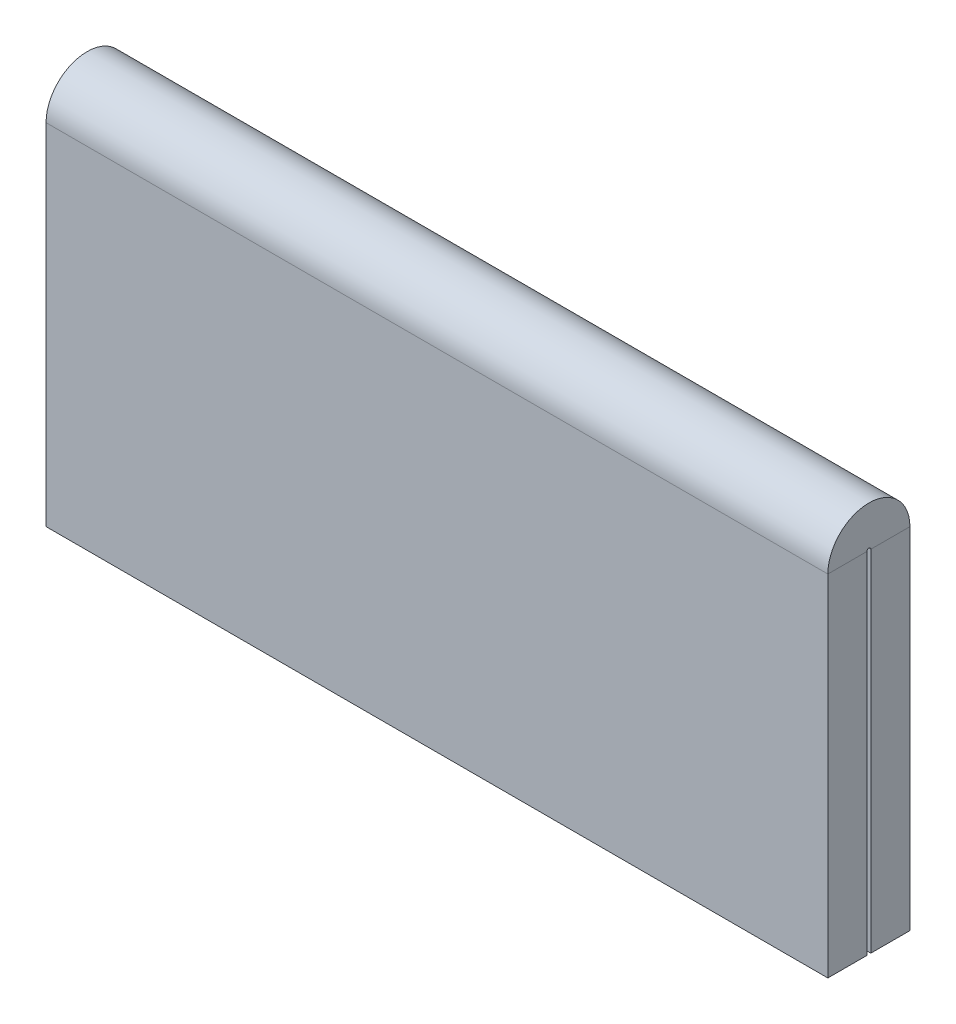
ISO-10303-21;
HEADER;
FILE_DESCRIPTION(('STEP AP214'),'2;1');
FILE_NAME('part.step','',(''),(''),'','','');
FILE_SCHEMA(('AUTOMOTIVE_DESIGN { 1 0 10303 214 1 1 1 1 }'));
ENDSEC;
DATA;
#1=APPLICATION_CONTEXT('core data for automotive mechanical design processes');
#2=APPLICATION_PROTOCOL_DEFINITION('international standard','automotive_design',2000,#1);
#3=PRODUCT_CONTEXT('',#1,'mechanical');
#4=PRODUCT('Part','Part','',(#3));
#5=PRODUCT_RELATED_PRODUCT_CATEGORY('part','',(#4));
#6=PRODUCT_DEFINITION_FORMATION('','',#4);
#7=PRODUCT_DEFINITION_CONTEXT('part definition',#1,'design');
#8=PRODUCT_DEFINITION('design','',#6,#7);
#9=PRODUCT_DEFINITION_SHAPE('','',#8);
#10=(LENGTH_UNIT() NAMED_UNIT(*) SI_UNIT(.MILLI.,.METRE.));
#11=(NAMED_UNIT(*) PLANE_ANGLE_UNIT() SI_UNIT($,.RADIAN.));
#12=(NAMED_UNIT(*) SI_UNIT($,.STERADIAN.) SOLID_ANGLE_UNIT());
#13=UNCERTAINTY_MEASURE_WITH_UNIT(LENGTH_MEASURE(1.E-05),#10,'distance_accuracy_value','');
#14=(GEOMETRIC_REPRESENTATION_CONTEXT(3) GLOBAL_UNCERTAINTY_ASSIGNED_CONTEXT((#13)) GLOBAL_UNIT_ASSIGNED_CONTEXT((#10,
#11,#12)) REPRESENTATION_CONTEXT('',''));
#15=CARTESIAN_POINT('',(0.,0.,0.));
#16=DIRECTION('',(0.,0.,1.));
#17=DIRECTION('',(1.,0.,0.));
#18=AXIS2_PLACEMENT_3D('',#15,#16,#17);
#19=CARTESIAN_POINT('',(0.,0.,-1.));
#20=DIRECTION('',(-1.,0.,0.));
#21=DIRECTION('',(0.,0.,1.));
#22=AXIS2_PLACEMENT_3D('',#19,#20,#21);
#23=PLANE('',#22);
#24=DIRECTION('',(0.,-1.,0.));
#25=VECTOR('',#24,1.);
#26=CARTESIAN_POINT('',(0.,0.,0.));
#27=LINE('',#26,#25);
#28=CARTESIAN_POINT('',(0.,8.95,0.));
#29=VERTEX_POINT('',#28);
#30=CARTESIAN_POINT('',(0.,0.,0.));
#31=VERTEX_POINT('',#30);
#32=EDGE_CURVE('E98',#29,#31,#27,.T.);
#33=ORIENTED_EDGE('',*,*,#32,.F.);
#34=DIRECTION('',(0.,0.,-1.));
#35=VECTOR('',#34,1.);
#36=CARTESIAN_POINT('',(0.,8.95,0.));
#37=LINE('',#36,#35);
#38=CARTESIAN_POINT('',(0.,8.95,-1.));
#39=VERTEX_POINT('',#38);
#40=EDGE_CURVE('E141',#29,#39,#37,.T.);
#41=ORIENTED_EDGE('',*,*,#40,.T.);
#42=DIRECTION('',(0.,-1.,0.));
#43=VECTOR('',#42,1.);
#44=CARTESIAN_POINT('',(0.,0.,-1.));
#45=LINE('',#44,#43);
#46=CARTESIAN_POINT('',(0.,0.,-1.));
#47=VERTEX_POINT('',#46);
#48=EDGE_CURVE('E94',#39,#47,#45,.T.);
#49=ORIENTED_EDGE('',*,*,#48,.T.);
#50=DIRECTION('',(0.,0.,1.));
#51=VECTOR('',#50,1.);
#52=CARTESIAN_POINT('',(0.,0.,-1.));
#53=LINE('',#52,#51);
#54=EDGE_CURVE('E48',#47,#31,#53,.T.);
#55=ORIENTED_EDGE('',*,*,#54,.T.);
#56=EDGE_LOOP('',(#33,#41,#49,#55));
#57=FACE_BOUND('',#56,.T.);
#58=ADVANCED_FACE('F44',(#57),#23,.T.);
#59=CARTESIAN_POINT('',(20.,0.,-1.));
#60=DIRECTION('',(1.,0.,0.));
#61=DIRECTION('',(0.,0.,-1.));
#62=AXIS2_PLACEMENT_3D('',#59,#60,#61);
#63=PLANE('',#62);
#64=DIRECTION('',(0.,0.,-1.));
#65=VECTOR('',#64,1.);
#66=CARTESIAN_POINT('',(20.,8.95,0.));
#67=LINE('',#66,#65);
#68=CARTESIAN_POINT('',(20.,8.95,0.));
#69=VERTEX_POINT('',#68);
#70=CARTESIAN_POINT('',(20.,8.95,-1.));
#71=VERTEX_POINT('',#70);
#72=EDGE_CURVE('E93',#69,#71,#67,.T.);
#73=ORIENTED_EDGE('',*,*,#72,.F.);
#74=DIRECTION('',(0.,1.,0.));
#75=VECTOR('',#74,1.);
#76=CARTESIAN_POINT('',(20.,0.,0.));
#77=LINE('',#76,#75);
#78=CARTESIAN_POINT('',(20.,0.,0.));
#79=VERTEX_POINT('',#78);
#80=EDGE_CURVE('E87',#79,#69,#77,.T.);
#81=ORIENTED_EDGE('',*,*,#80,.F.);
#82=DIRECTION('',(0.,0.,1.));
#83=VECTOR('',#82,1.);
#84=CARTESIAN_POINT('',(20.,0.,-1.));
#85=LINE('',#84,#83);
#86=CARTESIAN_POINT('',(20.,0.,-1.));
#87=VERTEX_POINT('',#86);
#88=EDGE_CURVE('E11',#87,#79,#85,.T.);
#89=ORIENTED_EDGE('',*,*,#88,.F.);
#90=DIRECTION('',(0.,1.,0.));
#91=VECTOR('',#90,1.);
#92=CARTESIAN_POINT('',(20.,0.,-1.));
#93=LINE('',#92,#91);
#94=EDGE_CURVE('E102',#87,#71,#93,.T.);
#95=ORIENTED_EDGE('',*,*,#94,.T.);
#96=EDGE_LOOP('',(#73,#81,#89,#95));
#97=FACE_BOUND('',#96,.T.);
#98=ADVANCED_FACE('F86',(#97),#63,.T.);
#99=CARTESIAN_POINT('',(0.,0.,-1.));
#100=DIRECTION('',(0.,-1.,0.));
#101=DIRECTION('',(0.,0.,-1.));
#102=AXIS2_PLACEMENT_3D('',#99,#100,#101);
#103=PLANE('',#102);
#104=DIRECTION('',(1.,0.,0.));
#105=VECTOR('',#104,1.);
#106=CARTESIAN_POINT('',(0.,0.,0.));
#107=LINE('',#106,#105);
#108=EDGE_CURVE('E82',#31,#79,#107,.T.);
#109=ORIENTED_EDGE('',*,*,#108,.F.);
#110=ORIENTED_EDGE('',*,*,#54,.F.);
#111=DIRECTION('',(1.,0.,0.));
#112=VECTOR('',#111,1.);
#113=CARTESIAN_POINT('',(0.,0.,-1.));
#114=LINE('',#113,#112);
#115=EDGE_CURVE('E83',#47,#87,#114,.T.);
#116=ORIENTED_EDGE('',*,*,#115,.T.);
#117=ORIENTED_EDGE('',*,*,#88,.T.);
#118=EDGE_LOOP('',(#109,#110,#116,#117));
#119=FACE_BOUND('',#118,.T.);
#120=ADVANCED_FACE('F80',(#119),#103,.T.);
#121=CARTESIAN_POINT('',(0.,0.,-1.));
#122=DIRECTION('',(0.,0.,-1.));
#123=DIRECTION('',(-1.,0.,0.));
#124=AXIS2_PLACEMENT_3D('',#121,#122,#123);
#125=PLANE('',#124);
#126=DIRECTION('',(-1.,0.,0.));
#127=VECTOR('',#126,1.);
#128=CARTESIAN_POINT('',(0.,8.95,-1.));
#129=LINE('',#128,#127);
#130=EDGE_CURVE('E160',#39,#71,#129,.F.);
#131=ORIENTED_EDGE('',*,*,#130,.T.);
#132=ORIENTED_EDGE('',*,*,#94,.F.);
#133=ORIENTED_EDGE('',*,*,#115,.F.);
#134=ORIENTED_EDGE('',*,*,#48,.F.);
#135=EDGE_LOOP('',(#131,#132,#133,#134));
#136=FACE_BOUND('',#135,.T.);
#137=ADVANCED_FACE('F164',(#136),#125,.T.);
#138=CARTESIAN_POINT('',(0.,0.,0.));
#139=DIRECTION('',(0.,0.,-1.));
#140=DIRECTION('',(-1.,0.,0.));
#141=AXIS2_PLACEMENT_3D('',#138,#139,#140);
#142=PLANE('',#141);
#143=ORIENTED_EDGE('',*,*,#80,.T.);
#144=DIRECTION('',(-1.,0.,0.));
#145=VECTOR('',#144,1.);
#146=CARTESIAN_POINT('',(0.,8.95,0.));
#147=LINE('',#146,#145);
#148=EDGE_CURVE('E149',#29,#69,#147,.F.);
#149=ORIENTED_EDGE('',*,*,#148,.F.);
#150=ORIENTED_EDGE('',*,*,#32,.T.);
#151=ORIENTED_EDGE('',*,*,#108,.T.);
#152=EDGE_LOOP('',(#143,#149,#150,#151));
#153=FACE_BOUND('',#152,.T.);
#154=ADVANCED_FACE('F96',(#153),#142,.F.);
#155=CARTESIAN_POINT('',(0.,4.475,1.1));
#156=DIRECTION('',(1.,0.,0.));
#157=DIRECTION('',(0.,1.,0.));
#158=AXIS2_PLACEMENT_3D('',#155,#156,#157);
#159=PLANE('',#158);
#160=DIRECTION('',(0.,0.,1.));
#161=VECTOR('',#160,1.);
#162=CARTESIAN_POINT('',(0.,8.95,1.1));
#163=LINE('',#162,#161);
#164=CARTESIAN_POINT('',(0.,8.95,0.1));
#165=VERTEX_POINT('',#164);
#166=CARTESIAN_POINT('',(0.,8.95,1.1));
#167=VERTEX_POINT('',#166);
#168=EDGE_CURVE('E113',#165,#167,#163,.T.);
#169=ORIENTED_EDGE('',*,*,#168,.F.);
#170=DIRECTION('',(0.,1.,0.));
#171=VECTOR('',#170,1.);
#172=CARTESIAN_POINT('',(0.,4.475,0.1));
#173=LINE('',#172,#171);
#174=CARTESIAN_POINT('',(0.,0.,0.1));
#175=VERTEX_POINT('',#174);
#176=EDGE_CURVE('E127',#175,#165,#173,.T.);
#177=ORIENTED_EDGE('',*,*,#176,.F.);
#178=DIRECTION('',(0.,0.,1.));
#179=VECTOR('',#178,1.);
#180=CARTESIAN_POINT('',(0.,0.,1.1));
#181=LINE('',#180,#179);
#182=CARTESIAN_POINT('',(0.,0.,1.1));
#183=VERTEX_POINT('',#182);
#184=EDGE_CURVE('E112',#175,#183,#181,.T.);
#185=ORIENTED_EDGE('',*,*,#184,.T.);
#186=DIRECTION('',(0.,1.,0.));
#187=VECTOR('',#186,1.);
#188=CARTESIAN_POINT('',(0.,4.475,1.1));
#189=LINE('',#188,#187);
#190=EDGE_CURVE('E139',#183,#167,#189,.T.);
#191=ORIENTED_EDGE('',*,*,#190,.T.);
#192=EDGE_LOOP('',(#169,#177,#185,#191));
#193=FACE_BOUND('',#192,.T.);
#194=ADVANCED_FACE('F191',(#193),#159,.F.);
#195=CARTESIAN_POINT('',(10.,0.,1.1));
#196=DIRECTION('',(0.,1.,0.));
#197=DIRECTION('',(-1.,0.,0.));
#198=AXIS2_PLACEMENT_3D('',#195,#196,#197);
#199=PLANE('',#198);
#200=ORIENTED_EDGE('',*,*,#184,.F.);
#201=DIRECTION('',(1.,0.,0.));
#202=VECTOR('',#201,1.);
#203=CARTESIAN_POINT('',(10.,0.,0.1));
#204=LINE('',#203,#202);
#205=CARTESIAN_POINT('',(20.,0.,0.1));
#206=VERTEX_POINT('',#205);
#207=EDGE_CURVE('E129',#206,#175,#204,.F.);
#208=ORIENTED_EDGE('',*,*,#207,.F.);
#209=DIRECTION('',(0.,0.,1.));
#210=VECTOR('',#209,1.);
#211=CARTESIAN_POINT('',(20.,0.,1.1));
#212=LINE('',#211,#210);
#213=CARTESIAN_POINT('',(20.,0.,1.1));
#214=VERTEX_POINT('',#213);
#215=EDGE_CURVE('E107',#206,#214,#212,.T.);
#216=ORIENTED_EDGE('',*,*,#215,.T.);
#217=DIRECTION('',(-1.,0.,0.));
#218=VECTOR('',#217,1.);
#219=CARTESIAN_POINT('',(10.,0.,1.1));
#220=LINE('',#219,#218);
#221=EDGE_CURVE('E115',#214,#183,#220,.T.);
#222=ORIENTED_EDGE('',*,*,#221,.T.);
#223=EDGE_LOOP('',(#200,#208,#216,#222));
#224=FACE_BOUND('',#223,.T.);
#225=ADVANCED_FACE('F197',(#224),#199,.F.);
#226=CARTESIAN_POINT('',(20.,4.475,1.1));
#227=DIRECTION('',(-1.,0.,0.));
#228=DIRECTION('',(0.,-1.,0.));
#229=AXIS2_PLACEMENT_3D('',#226,#227,#228);
#230=PLANE('',#229);
#231=DIRECTION('',(0.,1.,0.));
#232=VECTOR('',#231,1.);
#233=CARTESIAN_POINT('',(20.,4.475,0.1));
#234=LINE('',#233,#232);
#235=CARTESIAN_POINT('',(20.,8.95,0.1));
#236=VERTEX_POINT('',#235);
#237=EDGE_CURVE('E116',#236,#206,#234,.F.);
#238=ORIENTED_EDGE('',*,*,#237,.F.);
#239=DIRECTION('',(0.,0.,1.));
#240=VECTOR('',#239,1.);
#241=CARTESIAN_POINT('',(20.,8.95,1.1));
#242=LINE('',#241,#240);
#243=CARTESIAN_POINT('',(20.,8.95,1.1));
#244=VERTEX_POINT('',#243);
#245=EDGE_CURVE('E101',#236,#244,#242,.T.);
#246=ORIENTED_EDGE('',*,*,#245,.T.);
#247=DIRECTION('',(0.,-1.,0.));
#248=VECTOR('',#247,1.);
#249=CARTESIAN_POINT('',(20.,4.475,1.1));
#250=LINE('',#249,#248);
#251=EDGE_CURVE('E134',#244,#214,#250,.T.);
#252=ORIENTED_EDGE('',*,*,#251,.T.);
#253=ORIENTED_EDGE('',*,*,#215,.F.);
#254=EDGE_LOOP('',(#238,#246,#252,#253));
#255=FACE_BOUND('',#254,.T.);
#256=ADVANCED_FACE('F194',(#255),#230,.F.);
#257=CARTESIAN_POINT('',(10.,4.475,1.1));
#258=DIRECTION('',(0.,0.,1.));
#259=DIRECTION('',(1.,0.,0.));
#260=AXIS2_PLACEMENT_3D('',#257,#258,#259);
#261=PLANE('',#260);
#262=ORIENTED_EDGE('',*,*,#221,.F.);
#263=ORIENTED_EDGE('',*,*,#251,.F.);
#264=DIRECTION('',(1.,0.,0.));
#265=VECTOR('',#264,1.);
#266=CARTESIAN_POINT('',(10.,8.95,1.1));
#267=LINE('',#266,#265);
#268=EDGE_CURVE('E131',#167,#244,#267,.T.);
#269=ORIENTED_EDGE('',*,*,#268,.F.);
#270=ORIENTED_EDGE('',*,*,#190,.F.);
#271=EDGE_LOOP('',(#262,#263,#269,#270));
#272=FACE_BOUND('',#271,.T.);
#273=ADVANCED_FACE('F198',(#272),#261,.T.);
#274=CARTESIAN_POINT('',(10.,4.475,0.1));
#275=DIRECTION('',(0.,0.,1.));
#276=DIRECTION('',(1.,0.,0.));
#277=AXIS2_PLACEMENT_3D('',#274,#275,#276);
#278=PLANE('',#277);
#279=ORIENTED_EDGE('',*,*,#207,.T.);
#280=ORIENTED_EDGE('',*,*,#176,.T.);
#281=DIRECTION('',(1.,0.,0.));
#282=VECTOR('',#281,1.);
#283=CARTESIAN_POINT('',(10.,8.95,0.1));
#284=LINE('',#283,#282);
#285=EDGE_CURVE('E124',#165,#236,#284,.T.);
#286=ORIENTED_EDGE('',*,*,#285,.T.);
#287=ORIENTED_EDGE('',*,*,#237,.T.);
#288=EDGE_LOOP('',(#279,#280,#286,#287));
#289=FACE_BOUND('',#288,.T.);
#290=ADVANCED_FACE('F202',(#289),#278,.F.);
#291=CARTESIAN_POINT('',(20.,8.95,0.05));
#292=DIRECTION('',(1.,0.,0.));
#293=DIRECTION('',(0.,0.,-1.));
#294=AXIS2_PLACEMENT_3D('',#291,#292,#293);
#295=PLANE('',#294);
#296=ORIENTED_EDGE('',*,*,#245,.F.);
#297=CARTESIAN_POINT('',(20.,8.95,0.05));
#298=DIRECTION('',(-1.,0.,0.));
#299=DIRECTION('',(0.,0.,1.));
#300=AXIS2_PLACEMENT_3D('',#297,#298,#299);
#301=CIRCLE('',#300,0.05);
#302=EDGE_CURVE('E151',#69,#236,#301,.F.);
#303=ORIENTED_EDGE('',*,*,#302,.F.);
#304=ORIENTED_EDGE('',*,*,#72,.T.);
#305=CARTESIAN_POINT('',(20.,8.95,0.05));
#306=DIRECTION('',(-1.,0.,0.));
#307=DIRECTION('',(0.,0.,1.));
#308=AXIS2_PLACEMENT_3D('',#305,#306,#307);
#309=CIRCLE('',#308,1.05);
#310=EDGE_CURVE('E148',#71,#244,#309,.F.);
#311=ORIENTED_EDGE('',*,*,#310,.T.);
#312=EDGE_LOOP('',(#296,#303,#304,#311));
#313=FACE_BOUND('',#312,.T.);
#314=ADVANCED_FACE('F208',(#313),#295,.T.);
#315=CARTESIAN_POINT('',(0.,8.95,0.05));
#316=DIRECTION('',(1.,0.,0.));
#317=DIRECTION('',(0.,0.,-1.));
#318=AXIS2_PLACEMENT_3D('',#315,#316,#317);
#319=PLANE('',#318);
#320=CARTESIAN_POINT('',(0.,8.95,0.05));
#321=DIRECTION('',(-1.,0.,0.));
#322=DIRECTION('',(0.,0.,1.));
#323=AXIS2_PLACEMENT_3D('',#320,#321,#322);
#324=CIRCLE('',#323,0.05);
#325=EDGE_CURVE('E56',#165,#29,#324,.T.);
#326=ORIENTED_EDGE('',*,*,#325,.F.);
#327=ORIENTED_EDGE('',*,*,#168,.T.);
#328=CARTESIAN_POINT('',(0.,8.95,0.05));
#329=DIRECTION('',(-1.,0.,0.));
#330=DIRECTION('',(0.,0.,1.));
#331=AXIS2_PLACEMENT_3D('',#328,#329,#330);
#332=CIRCLE('',#331,1.05);
#333=EDGE_CURVE('E152',#167,#39,#332,.T.);
#334=ORIENTED_EDGE('',*,*,#333,.T.);
#335=ORIENTED_EDGE('',*,*,#40,.F.);
#336=EDGE_LOOP('',(#326,#327,#334,#335));
#337=FACE_BOUND('',#336,.T.);
#338=ADVANCED_FACE('F176',(#337),#319,.F.);
#339=CARTESIAN_POINT('',(0.,8.95,0.05));
#340=DIRECTION('',(-1.,0.,0.));
#341=DIRECTION('',(0.,0.,1.));
#342=AXIS2_PLACEMENT_3D('',#339,#340,#341);
#343=CYLINDRICAL_SURFACE('',#342,1.05);
#344=ORIENTED_EDGE('',*,*,#130,.F.);
#345=ORIENTED_EDGE('',*,*,#333,.F.);
#346=ORIENTED_EDGE('',*,*,#268,.T.);
#347=ORIENTED_EDGE('',*,*,#310,.F.);
#348=EDGE_LOOP('',(#344,#345,#346,#347));
#349=FACE_BOUND('',#348,.T.);
#350=ADVANCED_FACE('F174',(#349),#343,.T.);
#351=CARTESIAN_POINT('',(0.,8.95,0.05));
#352=DIRECTION('',(-1.,0.,0.));
#353=DIRECTION('',(0.,0.,1.));
#354=AXIS2_PLACEMENT_3D('',#351,#352,#353);
#355=CYLINDRICAL_SURFACE('',#354,0.05);
#356=ORIENTED_EDGE('',*,*,#148,.T.);
#357=ORIENTED_EDGE('',*,*,#302,.T.);
#358=ORIENTED_EDGE('',*,*,#285,.F.);
#359=ORIENTED_EDGE('',*,*,#325,.T.);
#360=EDGE_LOOP('',(#356,#357,#358,#359));
#361=FACE_BOUND('',#360,.T.);
#362=ADVANCED_FACE('F217',(#361),#355,.F.);
#363=CLOSED_SHELL('',(#58,#98,#120,#137,#154,#194,#225,#256,#273,#290,#314,#338,#350,#362));
#364=MANIFOLD_SOLID_BREP('B2',#363);
#365=ADVANCED_BREP_SHAPE_REPRESENTATION('',(#18,#364),#14);
#366=SHAPE_DEFINITION_REPRESENTATION(#9,#365);
ENDSEC;
END-ISO-10303-21;
